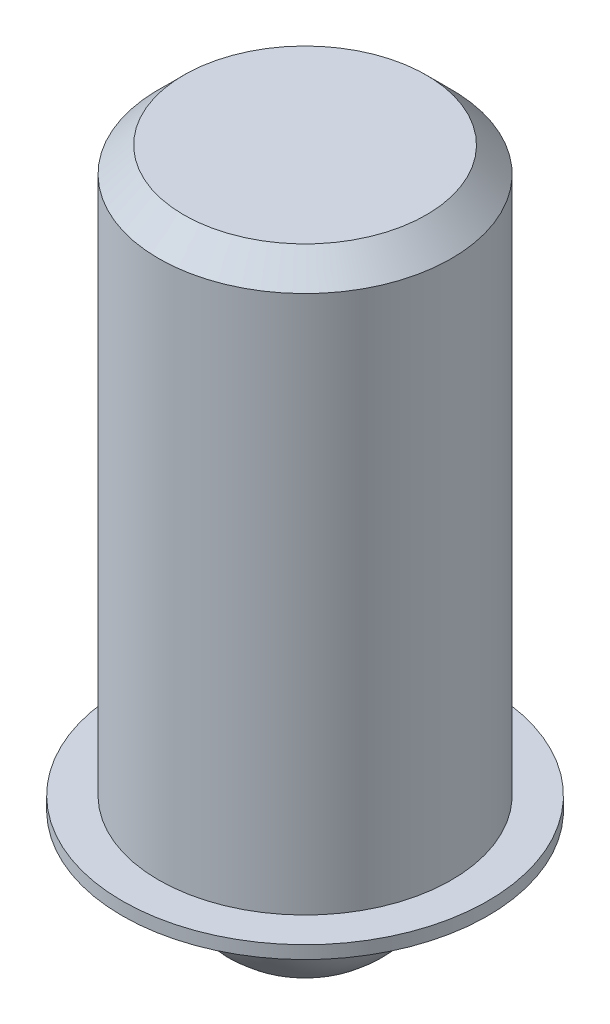
ISO-10303-21;
HEADER;
FILE_DESCRIPTION(('STEP AP214'),'2;1');
FILE_NAME('part.step','',(''),(''),'','','');
FILE_SCHEMA(('AUTOMOTIVE_DESIGN { 1 0 10303 214 1 1 1 1 }'));
ENDSEC;
DATA;
#1=APPLICATION_CONTEXT('core data for automotive mechanical design processes');
#2=APPLICATION_PROTOCOL_DEFINITION('international standard','automotive_design',2000,#1);
#3=PRODUCT_CONTEXT('',#1,'mechanical');
#4=PRODUCT('Part','Part','',(#3));
#5=PRODUCT_RELATED_PRODUCT_CATEGORY('part','',(#4));
#6=PRODUCT_DEFINITION_FORMATION('','',#4);
#7=PRODUCT_DEFINITION_CONTEXT('part definition',#1,'design');
#8=PRODUCT_DEFINITION('design','',#6,#7);
#9=PRODUCT_DEFINITION_SHAPE('','',#8);
#10=(LENGTH_UNIT() NAMED_UNIT(*) SI_UNIT(.MILLI.,.METRE.));
#11=(NAMED_UNIT(*) PLANE_ANGLE_UNIT() SI_UNIT($,.RADIAN.));
#12=(NAMED_UNIT(*) SI_UNIT($,.STERADIAN.) SOLID_ANGLE_UNIT());
#13=UNCERTAINTY_MEASURE_WITH_UNIT(LENGTH_MEASURE(1.E-05),#10,'distance_accuracy_value','');
#14=(GEOMETRIC_REPRESENTATION_CONTEXT(3) GLOBAL_UNCERTAINTY_ASSIGNED_CONTEXT((#13)) GLOBAL_UNIT_ASSIGNED_CONTEXT((#10,
#11,#12)) REPRESENTATION_CONTEXT('',''));
#15=CARTESIAN_POINT('',(0.,0.,0.));
#16=DIRECTION('',(0.,0.,1.));
#17=DIRECTION('',(1.,0.,0.));
#18=AXIS2_PLACEMENT_3D('',#15,#16,#17);
#19=CARTESIAN_POINT('',(0.,-5.1816,0.));
#20=DIRECTION('',(0.,-1.,0.));
#21=DIRECTION('',(0.,0.,1.));
#22=AXIS2_PLACEMENT_3D('',#19,#20,#21);
#23=SPHERICAL_SURFACE('',#22,2.3749);
#24=CARTESIAN_POINT('',(0.,-7.5565,0.));
#25=VERTEX_POINT('',#24);
#26=VERTEX_LOOP('',#25);
#27=FACE_BOUND('',#26,.T.);
#28=ADVANCED_FACE('F43',(#27),#23,.T.);
#29=CLOSED_SHELL('',(#28));
#30=MANIFOLD_SOLID_BREP('B2',#29);
#31=CARTESIAN_POINT('',(0.,-4.6609,2.3749));
#32=DIRECTION('',(0.,-1.,0.));
#33=DIRECTION('',(0.,0.,-1.));
#34=AXIS2_PLACEMENT_3D('',#31,#32,#33);
#35=PLANE('',#34);
#36=CARTESIAN_POINT('',(0.,-4.6609,0.));
#37=DIRECTION('',(0.,1.,0.));
#38=DIRECTION('',(0.,0.,1.));
#39=AXIS2_PLACEMENT_3D('',#36,#37,#38);
#40=CIRCLE('',#39,2.3749);
#41=CARTESIAN_POINT('',(0.,-4.6609,2.3749));
#42=VERTEX_POINT('',#41);
#43=EDGE_CURVE('E42',#42,#42,#40,.T.);
#44=ORIENTED_EDGE('',*,*,#43,.F.);
#45=EDGE_LOOP('',(#44));
#46=FACE_BOUND('',#45,.T.);
#47=ADVANCED_FACE('F55',(#46),#35,.T.);
#48=CARTESIAN_POINT('',(0.,7.5565,0.));
#49=DIRECTION('',(0.,1.,0.));
#50=DIRECTION('',(0.,0.,1.));
#51=AXIS2_PLACEMENT_3D('',#48,#49,#50);
#52=CYLINDRICAL_SURFACE('',#51,2.3749);
#53=ORIENTED_EDGE('',*,*,#43,.T.);
#54=EDGE_LOOP('',(#53));
#55=FACE_BOUND('',#54,.T.);
#56=CARTESIAN_POINT('',(0.,-5.7785,0.));
#57=DIRECTION('',(0.,1.,0.));
#58=DIRECTION('',(0.,0.,1.));
#59=AXIS2_PLACEMENT_3D('',#56,#57,#58);
#60=CIRCLE('',#59,2.3749);
#61=CARTESIAN_POINT('',(0.,-5.7785,2.3749));
#62=VERTEX_POINT('',#61);
#63=EDGE_CURVE('E61',#62,#62,#60,.T.);
#64=ORIENTED_EDGE('',*,*,#63,.F.);
#65=EDGE_LOOP('',(#64));
#66=FACE_BOUND('',#65,.T.);
#67=ADVANCED_FACE('F103',(#55,#66),#52,.F.);
#68=CARTESIAN_POINT('',(0.,-5.7785,2.6289));
#69=DIRECTION('',(0.,-1.,0.));
#70=DIRECTION('',(0.,0.,-1.));
#71=AXIS2_PLACEMENT_3D('',#68,#69,#70);
#72=PLANE('',#71);
#73=ORIENTED_EDGE('',*,*,#63,.T.);
#74=EDGE_LOOP('',(#73));
#75=FACE_BOUND('',#74,.T.);
#76=CARTESIAN_POINT('',(0.,-5.7785,0.));
#77=DIRECTION('',(0.,1.,0.));
#78=DIRECTION('',(0.,0.,1.));
#79=AXIS2_PLACEMENT_3D('',#76,#77,#78);
#80=CIRCLE('',#79,2.6289);
#81=CARTESIAN_POINT('',(0.,-5.7785,2.6289));
#82=VERTEX_POINT('',#81);
#83=EDGE_CURVE('E65',#82,#82,#80,.T.);
#84=ORIENTED_EDGE('',*,*,#83,.F.);
#85=EDGE_LOOP('',(#84));
#86=FACE_BOUND('',#85,.T.);
#87=ADVANCED_FACE('F108',(#75,#86),#72,.T.);
#88=CARTESIAN_POINT('',(0.,-4.9403,0.));
#89=DIRECTION('',(0.,1.,0.));
#90=DIRECTION('',(0.,0.,1.));
#91=AXIS2_PLACEMENT_3D('',#88,#89,#90);
#92=CONICAL_SURFACE('',#91,3.9624,1.00963291450654);
#93=ORIENTED_EDGE('',*,*,#83,.T.);
#94=EDGE_LOOP('',(#93));
#95=FACE_BOUND('',#94,.T.);
#96=CARTESIAN_POINT('',(0.,-4.9403,0.));
#97=DIRECTION('',(0.,1.,0.));
#98=DIRECTION('',(0.,0.,1.));
#99=AXIS2_PLACEMENT_3D('',#96,#97,#98);
#100=CIRCLE('',#99,3.9624);
#101=CARTESIAN_POINT('',(0.,-4.9403,3.9624));
#102=VERTEX_POINT('',#101);
#103=EDGE_CURVE('E69',#102,#102,#100,.T.);
#104=ORIENTED_EDGE('',*,*,#103,.F.);
#105=EDGE_LOOP('',(#104));
#106=FACE_BOUND('',#105,.T.);
#107=ADVANCED_FACE('F112',(#95,#106),#92,.T.);
#108=CARTESIAN_POINT('',(0.,7.5565,0.));
#109=DIRECTION('',(0.,1.,0.));
#110=DIRECTION('',(0.,0.,1.));
#111=AXIS2_PLACEMENT_3D('',#108,#109,#110);
#112=CYLINDRICAL_SURFACE('',#111,3.9624);
#113=ORIENTED_EDGE('',*,*,#103,.T.);
#114=EDGE_LOOP('',(#113));
#115=FACE_BOUND('',#114,.T.);
#116=CARTESIAN_POINT('',(0.,-4.6609,0.));
#117=DIRECTION('',(0.,1.,0.));
#118=DIRECTION('',(0.,0.,1.));
#119=AXIS2_PLACEMENT_3D('',#116,#117,#118);
#120=CIRCLE('',#119,3.9624);
#121=CARTESIAN_POINT('',(0.,-4.6609,3.9624));
#122=VERTEX_POINT('',#121);
#123=EDGE_CURVE('E74',#122,#122,#120,.T.);
#124=ORIENTED_EDGE('',*,*,#123,.F.);
#125=EDGE_LOOP('',(#124));
#126=FACE_BOUND('',#125,.T.);
#127=ADVANCED_FACE('F118',(#115,#126),#112,.T.);
#128=CARTESIAN_POINT('',(0.,-4.6609,3.9624));
#129=DIRECTION('',(0.,1.,0.));
#130=DIRECTION('',(0.,0.,1.));
#131=AXIS2_PLACEMENT_3D('',#128,#129,#130);
#132=PLANE('',#131);
#133=ORIENTED_EDGE('',*,*,#123,.T.);
#134=EDGE_LOOP('',(#133));
#135=FACE_BOUND('',#134,.T.);
#136=CARTESIAN_POINT('',(0.,-4.6609,0.));
#137=DIRECTION('',(0.,1.,0.));
#138=DIRECTION('',(0.,0.,1.));
#139=AXIS2_PLACEMENT_3D('',#136,#137,#138);
#140=CIRCLE('',#139,3.175);
#141=CARTESIAN_POINT('',(0.,-4.6609,3.175));
#142=VERTEX_POINT('',#141);
#143=EDGE_CURVE('E77',#142,#142,#140,.T.);
#144=ORIENTED_EDGE('',*,*,#143,.F.);
#145=EDGE_LOOP('',(#144));
#146=FACE_BOUND('',#145,.T.);
#147=ADVANCED_FACE('F99',(#135,#146),#132,.T.);
#148=CARTESIAN_POINT('',(0.,7.5565,0.));
#149=DIRECTION('',(0.,1.,0.));
#150=DIRECTION('',(0.,0.,1.));
#151=AXIS2_PLACEMENT_3D('',#148,#149,#150);
#152=CYLINDRICAL_SURFACE('',#151,3.175);
#153=ORIENTED_EDGE('',*,*,#143,.T.);
#154=EDGE_LOOP('',(#153));
#155=FACE_BOUND('',#154,.T.);
#156=CARTESIAN_POINT('',(0.,7.0104,0.));
#157=DIRECTION('',(0.,1.,0.));
#158=DIRECTION('',(0.,0.,1.));
#159=AXIS2_PLACEMENT_3D('',#156,#157,#158);
#160=CIRCLE('',#159,3.175);
#161=CARTESIAN_POINT('',(0.,7.0104,3.175));
#162=VERTEX_POINT('',#161);
#163=EDGE_CURVE('E80',#162,#162,#160,.T.);
#164=ORIENTED_EDGE('',*,*,#163,.F.);
#165=EDGE_LOOP('',(#164));
#166=FACE_BOUND('',#165,.T.);
#167=ADVANCED_FACE('F91',(#155,#166),#152,.T.);
#168=CARTESIAN_POINT('',(0.,7.5565,0.));
#169=DIRECTION('',(0.,-1.,0.));
#170=DIRECTION('',(0.,0.,-1.));
#171=AXIS2_PLACEMENT_3D('',#168,#169,#170);
#172=CONICAL_SURFACE('',#171,2.6289,0.785398163397449);
#173=ORIENTED_EDGE('',*,*,#163,.T.);
#174=EDGE_LOOP('',(#173));
#175=FACE_BOUND('',#174,.T.);
#176=CARTESIAN_POINT('',(0.,7.5565,0.));
#177=DIRECTION('',(0.,1.,0.));
#178=DIRECTION('',(0.,0.,1.));
#179=AXIS2_PLACEMENT_3D('',#176,#177,#178);
#180=CIRCLE('',#179,2.6289);
#181=CARTESIAN_POINT('',(0.,7.5565,2.6289));
#182=VERTEX_POINT('',#181);
#183=EDGE_CURVE('E83',#182,#182,#180,.T.);
#184=ORIENTED_EDGE('',*,*,#183,.F.);
#185=EDGE_LOOP('',(#184));
#186=FACE_BOUND('',#185,.T.);
#187=ADVANCED_FACE('F89',(#175,#186),#172,.T.);
#188=CARTESIAN_POINT('',(0.,7.5565,2.6289));
#189=DIRECTION('',(0.,1.,0.));
#190=DIRECTION('',(0.,0.,1.));
#191=AXIS2_PLACEMENT_3D('',#188,#189,#190);
#192=PLANE('',#191);
#193=ORIENTED_EDGE('',*,*,#183,.T.);
#194=EDGE_LOOP('',(#193));
#195=FACE_BOUND('',#194,.T.);
#196=ADVANCED_FACE('F87',(#195),#192,.T.);
#197=CLOSED_SHELL('',(#47,#67,#87,#107,#127,#147,#167,#187,#196));
#198=MANIFOLD_SOLID_BREP('B6',#197);
#199=ADVANCED_BREP_SHAPE_REPRESENTATION('',(#18,#30,#198),#14);
#200=SHAPE_DEFINITION_REPRESENTATION(#9,#199);
ENDSEC;
END-ISO-10303-21;
